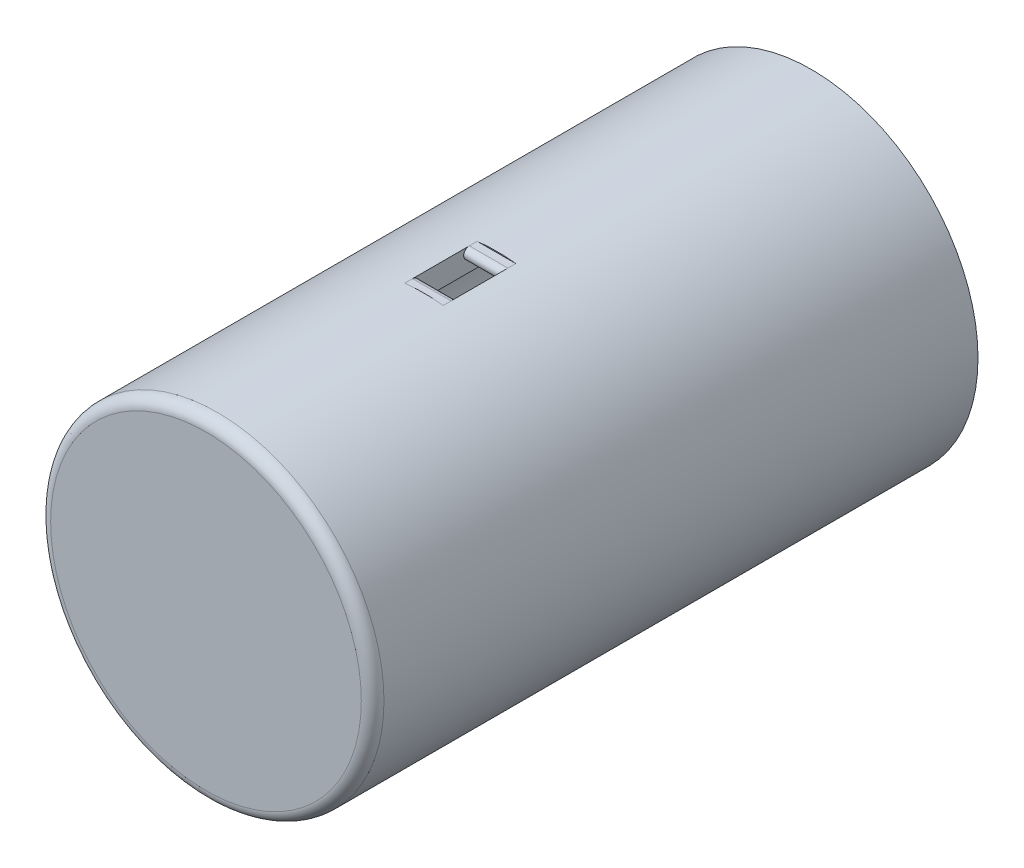
ISO-10303-21;
HEADER;
FILE_DESCRIPTION(('STEP AP214'),'2;1');
FILE_NAME('part.step','',(''),(''),'','','');
FILE_SCHEMA(('AUTOMOTIVE_DESIGN { 1 0 10303 214 1 1 1 1 }'));
ENDSEC;
DATA;
#1=APPLICATION_CONTEXT('core data for automotive mechanical design processes');
#2=APPLICATION_PROTOCOL_DEFINITION('international standard','automotive_design',2000,#1);
#3=PRODUCT_CONTEXT('',#1,'mechanical');
#4=PRODUCT('Part','Part','',(#3));
#5=PRODUCT_RELATED_PRODUCT_CATEGORY('part','',(#4));
#6=PRODUCT_DEFINITION_FORMATION('','',#4);
#7=PRODUCT_DEFINITION_CONTEXT('part definition',#1,'design');
#8=PRODUCT_DEFINITION('design','',#6,#7);
#9=PRODUCT_DEFINITION_SHAPE('','',#8);
#10=(LENGTH_UNIT() NAMED_UNIT(*) SI_UNIT(.MILLI.,.METRE.));
#11=(NAMED_UNIT(*) PLANE_ANGLE_UNIT() SI_UNIT($,.RADIAN.));
#12=(NAMED_UNIT(*) SI_UNIT($,.STERADIAN.) SOLID_ANGLE_UNIT());
#13=UNCERTAINTY_MEASURE_WITH_UNIT(LENGTH_MEASURE(1.E-05),#10,'distance_accuracy_value','');
#14=(GEOMETRIC_REPRESENTATION_CONTEXT(3) GLOBAL_UNCERTAINTY_ASSIGNED_CONTEXT((#13)) GLOBAL_UNIT_ASSIGNED_CONTEXT((#10,
#11,#12)) REPRESENTATION_CONTEXT('',''));
#15=CARTESIAN_POINT('',(0.,0.,0.));
#16=DIRECTION('',(0.,0.,1.));
#17=DIRECTION('',(1.,0.,0.));
#18=AXIS2_PLACEMENT_3D('',#15,#16,#17);
#19=CARTESIAN_POINT('',(-1.7,14.7,27.7738477170273));
#20=DIRECTION('',(0.,0.,-1.));
#21=DIRECTION('',(-1.,0.,0.));
#22=AXIS2_PLACEMENT_3D('',#19,#20,#21);
#23=PLANE('',#22);
#24=DIRECTION('',(-1.,0.,0.));
#25=VECTOR('',#24,1.);
#26=CARTESIAN_POINT('',(14.702,14.6013697987552,27.7738477170273));
#27=LINE('',#26,#25);
#28=CARTESIAN_POINT('',(1.69999999999999,14.6013697987552,27.7738477170273));
#29=VERTEX_POINT('',#28);
#30=CARTESIAN_POINT('',(-1.7,14.6013697987552,27.7738477170273));
#31=VERTEX_POINT('',#30);
#32=EDGE_CURVE('E351',#29,#31,#27,.T.);
#33=ORIENTED_EDGE('',*,*,#32,.F.);
#34=CARTESIAN_POINT('',(0.,0.,27.7738477170273));
#35=DIRECTION('',(0.,0.,-1.));
#36=DIRECTION('',(-1.,0.,0.));
#37=AXIS2_PLACEMENT_3D('',#34,#35,#36);
#38=CIRCLE('',#37,14.7);
#39=EDGE_CURVE('E464',#31,#29,#38,.T.);
#40=ORIENTED_EDGE('',*,*,#39,.F.);
#41=EDGE_LOOP('',(#33,#40));
#42=FACE_BOUND('',#41,.T.);
#43=ADVANCED_FACE('F39',(#42),#23,.F.);
#44=CARTESIAN_POINT('',(0.,12.7,0.));
#45=DIRECTION('',(0.,1.,0.));
#46=DIRECTION('',(0.,0.,1.));
#47=AXIS2_PLACEMENT_3D('',#44,#45,#46);
#48=PLANE('',#47);
#49=DIRECTION('',(0.,0.,1.));
#50=VECTOR('',#49,1.);
#51=CARTESIAN_POINT('',(1.7,12.7,0.));
#52=LINE('',#51,#50);
#53=CARTESIAN_POINT('',(1.7,12.7,0.));
#54=VERTEX_POINT('',#53);
#55=CARTESIAN_POINT('',(1.7,12.7,27.5667409358408));
#56=VERTEX_POINT('',#55);
#57=EDGE_CURVE('E375',#54,#56,#52,.T.);
#58=ORIENTED_EDGE('',*,*,#57,.T.);
#59=DIRECTION('',(1.,0.,0.));
#60=VECTOR('',#59,1.);
#61=CARTESIAN_POINT('',(0.,12.7,27.5667409358408));
#62=LINE('',#61,#60);
#63=CARTESIAN_POINT('',(-1.7,12.7,27.5667409358408));
#64=VERTEX_POINT('',#63);
#65=EDGE_CURVE('E187',#56,#64,#62,.F.);
#66=ORIENTED_EDGE('',*,*,#65,.T.);
#67=DIRECTION('',(0.,0.,-1.));
#68=VECTOR('',#67,1.);
#69=CARTESIAN_POINT('',(-1.7,12.7,0.));
#70=LINE('',#69,#68);
#71=CARTESIAN_POINT('',(-1.7,12.7,0.));
#72=VERTEX_POINT('',#71);
#73=EDGE_CURVE('E339',#64,#72,#70,.T.);
#74=ORIENTED_EDGE('',*,*,#73,.T.);
#75=DIRECTION('',(1.,0.,0.));
#76=VECTOR('',#75,1.);
#77=CARTESIAN_POINT('',(-1.7,12.7,0.));
#78=LINE('',#77,#76);
#79=EDGE_CURVE('E363',#72,#54,#78,.T.);
#80=ORIENTED_EDGE('',*,*,#79,.T.);
#81=EDGE_LOOP('',(#58,#66,#74,#80));
#82=FACE_BOUND('',#81,.T.);
#83=ADVANCED_FACE('F234',(#82),#48,.F.);
#84=CARTESIAN_POINT('',(-1.7,12.7,50.));
#85=VERTEX_POINT('',#84);
#86=CARTESIAN_POINT('',(-1.7,12.7,34.3809544982139));
#87=VERTEX_POINT('',#86);
#88=EDGE_CURVE('E343',#85,#87,#70,.T.);
#89=ORIENTED_EDGE('',*,*,#88,.T.);
#90=DIRECTION('',(-1.,0.,0.));
#91=VECTOR('',#90,1.);
#92=CARTESIAN_POINT('',(0.,12.7,34.3809544982139));
#93=LINE('',#92,#91);
#94=CARTESIAN_POINT('',(1.7,12.7,34.3809544982139));
#95=VERTEX_POINT('',#94);
#96=EDGE_CURVE('E182',#87,#95,#93,.F.);
#97=ORIENTED_EDGE('',*,*,#96,.T.);
#98=CARTESIAN_POINT('',(1.7,12.7,50.));
#99=VERTEX_POINT('',#98);
#100=EDGE_CURVE('E336',#95,#99,#52,.T.);
#101=ORIENTED_EDGE('',*,*,#100,.T.);
#102=DIRECTION('',(-1.,0.,0.));
#103=VECTOR('',#102,1.);
#104=CARTESIAN_POINT('',(-1.7,12.7,50.));
#105=LINE('',#104,#103);
#106=EDGE_CURVE('E371',#99,#85,#105,.T.);
#107=ORIENTED_EDGE('',*,*,#106,.T.);
#108=EDGE_LOOP('',(#89,#97,#101,#107));
#109=FACE_BOUND('',#108,.T.);
#110=ADVANCED_FACE('F245',(#109),#48,.F.);
#111=CARTESIAN_POINT('',(0.,0.,0.));
#112=DIRECTION('',(0.,0.,1.));
#113=DIRECTION('',(1.,0.,0.));
#114=AXIS2_PLACEMENT_3D('',#111,#112,#113);
#115=PLANE('',#114);
#116=CARTESIAN_POINT('',(0.,0.,0.));
#117=DIRECTION('',(0.,0.,1.));
#118=DIRECTION('',(1.,0.,0.));
#119=AXIS2_PLACEMENT_3D('',#116,#117,#118);
#120=CIRCLE('',#119,14.7);
#121=CARTESIAN_POINT('',(14.7,0.,0.));
#122=VERTEX_POINT('',#121);
#123=EDGE_CURVE('E450',#122,#122,#120,.T.);
#124=ORIENTED_EDGE('',*,*,#123,.F.);
#125=EDGE_LOOP('',(#124));
#126=FACE_BOUND('',#125,.T.);
#127=ORIENTED_EDGE('',*,*,#79,.F.);
#128=DIRECTION('',(0.,1.,0.));
#129=VECTOR('',#128,1.);
#130=CARTESIAN_POINT('',(-1.7,-14.701,0.));
#131=LINE('',#130,#129);
#132=CARTESIAN_POINT('',(-1.7,12.5857061780418,0.));
#133=VERTEX_POINT('',#132);
#134=EDGE_CURVE('E356',#133,#72,#131,.T.);
#135=ORIENTED_EDGE('',*,*,#134,.F.);
#136=CARTESIAN_POINT('',(0.,0.,0.));
#137=DIRECTION('',(0.,0.,1.));
#138=DIRECTION('',(1.,0.,0.));
#139=AXIS2_PLACEMENT_3D('',#136,#137,#138);
#140=CIRCLE('',#139,12.7);
#141=CARTESIAN_POINT('',(-1.7,-12.5857061780418,0.));
#142=VERTEX_POINT('',#141);
#143=EDGE_CURVE('E443',#142,#133,#140,.F.);
#144=ORIENTED_EDGE('',*,*,#143,.F.);
#145=DIRECTION('',(0.,-1.,0.));
#146=VECTOR('',#145,1.);
#147=CARTESIAN_POINT('',(-1.7,14.701,0.));
#148=LINE('',#147,#146);
#149=CARTESIAN_POINT('',(-1.7,-12.7,0.));
#150=VERTEX_POINT('',#149);
#151=EDGE_CURVE('E430',#142,#150,#148,.T.);
#152=ORIENTED_EDGE('',*,*,#151,.T.);
#153=DIRECTION('',(-1.,0.,0.));
#154=VECTOR('',#153,1.);
#155=CARTESIAN_POINT('',(1.7,-12.7,0.));
#156=LINE('',#155,#154);
#157=CARTESIAN_POINT('',(1.7,-12.7,0.));
#158=VERTEX_POINT('',#157);
#159=EDGE_CURVE('E423',#158,#150,#156,.T.);
#160=ORIENTED_EDGE('',*,*,#159,.F.);
#161=DIRECTION('',(0.,-1.,0.));
#162=VECTOR('',#161,1.);
#163=CARTESIAN_POINT('',(1.7,14.701,0.));
#164=LINE('',#163,#162);
#165=CARTESIAN_POINT('',(1.7,-12.5857061780418,0.));
#166=VERTEX_POINT('',#165);
#167=EDGE_CURVE('E413',#166,#158,#164,.T.);
#168=ORIENTED_EDGE('',*,*,#167,.F.);
#169=CARTESIAN_POINT('',(1.7,12.5857061780418,0.));
#170=VERTEX_POINT('',#169);
#171=EDGE_CURVE('E442',#170,#166,#140,.F.);
#172=ORIENTED_EDGE('',*,*,#171,.F.);
#173=DIRECTION('',(0.,1.,0.));
#174=VECTOR('',#173,1.);
#175=CARTESIAN_POINT('',(1.7,-14.701,0.));
#176=LINE('',#175,#174);
#177=EDGE_CURVE('E377',#170,#54,#176,.T.);
#178=ORIENTED_EDGE('',*,*,#177,.T.);
#179=EDGE_LOOP('',(#127,#135,#144,#152,#160,#168,#172,#178));
#180=FACE_BOUND('',#179,.T.);
#181=ADVANCED_FACE('F296',(#126,#180),#115,.F.);
#182=CARTESIAN_POINT('',(0.,0.,-0.001000000000001));
#183=DIRECTION('',(0.,0.,1.));
#184=DIRECTION('',(1.,0.,0.));
#185=AXIS2_PLACEMENT_3D('',#182,#183,#184);
#186=CYLINDRICAL_SURFACE('',#185,12.7);
#187=CARTESIAN_POINT('',(0.,0.,50.));
#188=DIRECTION('',(0.,0.,1.));
#189=DIRECTION('',(1.,0.,0.));
#190=AXIS2_PLACEMENT_3D('',#187,#188,#189);
#191=CIRCLE('',#190,12.7);
#192=CARTESIAN_POINT('',(1.7,-12.5857061780418,50.));
#193=VERTEX_POINT('',#192);
#194=CARTESIAN_POINT('',(1.7,12.5857061780418,50.));
#195=VERTEX_POINT('',#194);
#196=EDGE_CURVE('E439',#193,#195,#191,.T.);
#197=ORIENTED_EDGE('',*,*,#196,.T.);
#198=DIRECTION('',(0.,0.,1.));
#199=VECTOR('',#198,1.);
#200=CARTESIAN_POINT('',(1.7,12.5857061780418,-0.001000000000001));
#201=LINE('',#200,#199);
#202=EDGE_CURVE('E369',#195,#170,#201,.F.);
#203=ORIENTED_EDGE('',*,*,#202,.T.);
#204=ORIENTED_EDGE('',*,*,#171,.T.);
#205=DIRECTION('',(0.,0.,1.));
#206=VECTOR('',#205,1.);
#207=CARTESIAN_POINT('',(1.7,-12.5857061780418,-0.001000000000001));
#208=LINE('',#207,#206);
#209=EDGE_CURVE('E419',#166,#193,#208,.T.);
#210=ORIENTED_EDGE('',*,*,#209,.T.);
#211=EDGE_LOOP('',(#197,#203,#204,#210));
#212=FACE_BOUND('',#211,.T.);
#213=ADVANCED_FACE('F280',(#212),#186,.F.);
#214=CARTESIAN_POINT('',(1.7,-14.7,34.1738477170273));
#215=DIRECTION('',(0.,0.,1.));
#216=DIRECTION('',(1.,0.,0.));
#217=AXIS2_PLACEMENT_3D('',#214,#215,#216);
#218=PLANE('',#217);
#219=DIRECTION('',(-1.,0.,0.));
#220=VECTOR('',#219,1.);
#221=CARTESIAN_POINT('',(14.702,-14.6013697987552,34.1738477170273));
#222=LINE('',#221,#220);
#223=CARTESIAN_POINT('',(1.7,-14.6013697987552,34.1738477170273));
#224=VERTEX_POINT('',#223);
#225=CARTESIAN_POINT('',(-1.7,-14.6013697987552,34.1738477170273));
#226=VERTEX_POINT('',#225);
#227=EDGE_CURVE('E402',#224,#226,#222,.T.);
#228=ORIENTED_EDGE('',*,*,#227,.F.);
#229=CARTESIAN_POINT('',(0.,0.,34.1738477170273));
#230=DIRECTION('',(0.,0.,1.));
#231=DIRECTION('',(1.,0.,0.));
#232=AXIS2_PLACEMENT_3D('',#229,#230,#231);
#233=CIRCLE('',#232,14.7);
#234=EDGE_CURVE('E458',#226,#224,#233,.T.);
#235=ORIENTED_EDGE('',*,*,#234,.F.);
#236=EDGE_LOOP('',(#228,#235));
#237=FACE_BOUND('',#236,.T.);
#238=ADVANCED_FACE('F271',(#237),#218,.F.);
#239=CARTESIAN_POINT('',(0.,-12.7,0.));
#240=DIRECTION('',(0.,-1.,0.));
#241=DIRECTION('',(0.,0.,-1.));
#242=AXIS2_PLACEMENT_3D('',#239,#240,#241);
#243=PLANE('',#242);
#244=DIRECTION('',(0.,0.,1.));
#245=VECTOR('',#244,1.);
#246=CARTESIAN_POINT('',(-1.7,-12.7,0.));
#247=LINE('',#246,#245);
#248=CARTESIAN_POINT('',(-1.7,-12.7,27.5667409358408));
#249=VERTEX_POINT('',#248);
#250=EDGE_CURVE('E431',#150,#249,#247,.T.);
#251=ORIENTED_EDGE('',*,*,#250,.T.);
#252=DIRECTION('',(-1.,0.,0.));
#253=VECTOR('',#252,1.);
#254=CARTESIAN_POINT('',(0.,-12.7,27.5667409358408));
#255=LINE('',#254,#253);
#256=CARTESIAN_POINT('',(1.7,-12.7,27.5667409358408));
#257=VERTEX_POINT('',#256);
#258=EDGE_CURVE('E477',#249,#257,#255,.F.);
#259=ORIENTED_EDGE('',*,*,#258,.T.);
#260=DIRECTION('',(0.,0.,-1.));
#261=VECTOR('',#260,1.);
#262=CARTESIAN_POINT('',(1.7,-12.7,0.));
#263=LINE('',#262,#261);
#264=EDGE_CURVE('E412',#257,#158,#263,.T.);
#265=ORIENTED_EDGE('',*,*,#264,.T.);
#266=ORIENTED_EDGE('',*,*,#159,.T.);
#267=EDGE_LOOP('',(#251,#259,#265,#266));
#268=FACE_BOUND('',#267,.T.);
#269=ADVANCED_FACE('F277',(#268),#243,.F.);
#270=CARTESIAN_POINT('',(1.7,-12.7,50.));
#271=VERTEX_POINT('',#270);
#272=CARTESIAN_POINT('',(1.7,-12.7,34.3809544982139));
#273=VERTEX_POINT('',#272);
#274=EDGE_CURVE('E414',#271,#273,#263,.T.);
#275=ORIENTED_EDGE('',*,*,#274,.T.);
#276=DIRECTION('',(1.,0.,0.));
#277=VECTOR('',#276,1.);
#278=CARTESIAN_POINT('',(0.,-12.7,34.3809544982139));
#279=LINE('',#278,#277);
#280=CARTESIAN_POINT('',(-1.7,-12.7,34.3809544982139));
#281=VERTEX_POINT('',#280);
#282=EDGE_CURVE('E491',#273,#281,#279,.F.);
#283=ORIENTED_EDGE('',*,*,#282,.T.);
#284=CARTESIAN_POINT('',(-1.7,-12.7,50.));
#285=VERTEX_POINT('',#284);
#286=EDGE_CURVE('E427',#281,#285,#247,.T.);
#287=ORIENTED_EDGE('',*,*,#286,.T.);
#288=DIRECTION('',(1.,0.,0.));
#289=VECTOR('',#288,1.);
#290=CARTESIAN_POINT('',(1.7,-12.7,50.));
#291=LINE('',#290,#289);
#292=EDGE_CURVE('E428',#285,#271,#291,.T.);
#293=ORIENTED_EDGE('',*,*,#292,.T.);
#294=EDGE_LOOP('',(#275,#283,#287,#293));
#295=FACE_BOUND('',#294,.T.);
#296=ADVANCED_FACE('F288',(#295),#243,.F.);
#297=CARTESIAN_POINT('',(0.,0.,50.));
#298=DIRECTION('',(0.,0.,-1.));
#299=DIRECTION('',(-1.,0.,0.));
#300=AXIS2_PLACEMENT_3D('',#297,#298,#299);
#301=CYLINDRICAL_SURFACE('',#300,14.7);
#302=CARTESIAN_POINT('',(0.,0.,52.4));
#303=DIRECTION('',(0.,0.,1.));
#304=DIRECTION('',(1.,0.,0.));
#305=AXIS2_PLACEMENT_3D('',#302,#303,#304);
#306=CIRCLE('',#305,14.7);
#307=CARTESIAN_POINT('',(14.7,0.,52.4));
#308=VERTEX_POINT('',#307);
#309=EDGE_CURVE('E11',#308,#308,#306,.F.);
#310=ORIENTED_EDGE('',*,*,#309,.T.);
#311=EDGE_LOOP('',(#310));
#312=FACE_BOUND('',#311,.T.);
#313=DIRECTION('',(0.,0.,-1.));
#314=VECTOR('',#313,1.);
#315=CARTESIAN_POINT('',(-1.7,14.6013697987552,50.));
#316=LINE('',#315,#314);
#317=CARTESIAN_POINT('',(-1.7,14.6013697987552,34.1738477170273));
#318=VERTEX_POINT('',#317);
#319=CARTESIAN_POINT('',(-1.7,14.6013697987552,33.4795846994587));
#320=VERTEX_POINT('',#319);
#321=EDGE_CURVE('E472',#318,#320,#316,.T.);
#322=ORIENTED_EDGE('',*,*,#321,.T.);
#323=CARTESIAN_POINT('',(-1.7,14.6013697987552,28.4681107345959));
#324=VERTEX_POINT('',#323);
#325=EDGE_CURVE('E65',#320,#324,#316,.T.);
#326=ORIENTED_EDGE('',*,*,#325,.T.);
#327=DIRECTION('',(0.,0.,1.));
#328=VECTOR('',#327,1.);
#329=CARTESIAN_POINT('',(-1.7,14.6013697987552,27.7738477170273));
#330=LINE('',#329,#328);
#331=EDGE_CURVE('E176',#31,#324,#330,.T.);
#332=ORIENTED_EDGE('',*,*,#331,.F.);
#333=ORIENTED_EDGE('',*,*,#39,.T.);
#334=DIRECTION('',(0.,0.,-1.));
#335=VECTOR('',#334,1.);
#336=CARTESIAN_POINT('',(1.69999999999999,14.6013697987552,50.));
#337=LINE('',#336,#335);
#338=CARTESIAN_POINT('',(1.69999999999999,14.6013697987552,28.4681107345959));
#339=VERTEX_POINT('',#338);
#340=EDGE_CURVE('E467',#29,#339,#337,.F.);
#341=ORIENTED_EDGE('',*,*,#340,.T.);
#342=CARTESIAN_POINT('',(1.7,14.6013697987552,33.4795846994587));
#343=VERTEX_POINT('',#342);
#344=EDGE_CURVE('E53',#339,#343,#337,.F.);
#345=ORIENTED_EDGE('',*,*,#344,.T.);
#346=DIRECTION('',(0.,0.,-1.));
#347=VECTOR('',#346,1.);
#348=CARTESIAN_POINT('',(1.7,14.6013697987552,34.1738477170273));
#349=LINE('',#348,#347);
#350=CARTESIAN_POINT('',(1.69999999999999,14.6013697987552,34.1738477170273));
#351=VERTEX_POINT('',#350);
#352=EDGE_CURVE('E338',#351,#343,#349,.T.);
#353=ORIENTED_EDGE('',*,*,#352,.F.);
#354=CARTESIAN_POINT('',(0.,0.,34.1738477170273));
#355=DIRECTION('',(0.,0.,1.));
#356=DIRECTION('',(1.,0.,0.));
#357=AXIS2_PLACEMENT_3D('',#354,#355,#356);
#358=CIRCLE('',#357,14.7);
#359=EDGE_CURVE('E466',#351,#318,#358,.T.);
#360=ORIENTED_EDGE('',*,*,#359,.T.);
#361=EDGE_LOOP('',(#322,#326,#332,#333,#341,#345,#353,#360));
#362=FACE_BOUND('',#361,.T.);
#363=DIRECTION('',(0.,0.,-1.));
#364=VECTOR('',#363,1.);
#365=CARTESIAN_POINT('',(1.7,-14.6013697987552,50.));
#366=LINE('',#365,#364);
#367=CARTESIAN_POINT('',(1.7,-14.6013697987552,33.4795846994587));
#368=VERTEX_POINT('',#367);
#369=EDGE_CURVE('E459',#224,#368,#366,.T.);
#370=ORIENTED_EDGE('',*,*,#369,.T.);
#371=CARTESIAN_POINT('',(1.7,-14.6013697987552,28.4681107345959));
#372=VERTEX_POINT('',#371);
#373=EDGE_CURVE('E457',#368,#372,#366,.T.);
#374=ORIENTED_EDGE('',*,*,#373,.T.);
#375=DIRECTION('',(0.,0.,1.));
#376=VECTOR('',#375,1.);
#377=CARTESIAN_POINT('',(1.7,-14.6013697987552,29.6752175157825));
#378=LINE('',#377,#376);
#379=CARTESIAN_POINT('',(1.69999999999999,-14.6013697987552,27.7738477170273));
#380=VERTEX_POINT('',#379);
#381=EDGE_CURVE('E394',#380,#372,#378,.T.);
#382=ORIENTED_EDGE('',*,*,#381,.F.);
#383=CARTESIAN_POINT('',(0.,0.,27.7738477170273));
#384=DIRECTION('',(0.,0.,-1.));
#385=DIRECTION('',(-1.,0.,0.));
#386=AXIS2_PLACEMENT_3D('',#383,#384,#385);
#387=CIRCLE('',#386,14.7);
#388=CARTESIAN_POINT('',(-1.7,-14.6013697987552,27.7738477170273));
#389=VERTEX_POINT('',#388);
#390=EDGE_CURVE('E448',#380,#389,#387,.T.);
#391=ORIENTED_EDGE('',*,*,#390,.T.);
#392=DIRECTION('',(0.,0.,-1.));
#393=VECTOR('',#392,1.);
#394=CARTESIAN_POINT('',(-1.7,-14.6013697987552,50.));
#395=LINE('',#394,#393);
#396=CARTESIAN_POINT('',(-1.7,-14.6013697987552,28.4681107345959));
#397=VERTEX_POINT('',#396);
#398=EDGE_CURVE('E453',#389,#397,#395,.F.);
#399=ORIENTED_EDGE('',*,*,#398,.T.);
#400=CARTESIAN_POINT('',(-1.7,-14.6013697987552,33.4795846994587));
#401=VERTEX_POINT('',#400);
#402=EDGE_CURVE('E103',#397,#401,#395,.F.);
#403=ORIENTED_EDGE('',*,*,#402,.T.);
#404=DIRECTION('',(0.,0.,-1.));
#405=VECTOR('',#404,1.);
#406=CARTESIAN_POINT('',(-1.7,-14.6013697987552,32.2724779182721));
#407=LINE('',#406,#405);
#408=EDGE_CURVE('E389',#226,#401,#407,.T.);
#409=ORIENTED_EDGE('',*,*,#408,.F.);
#410=ORIENTED_EDGE('',*,*,#234,.T.);
#411=EDGE_LOOP('',(#370,#374,#382,#391,#399,#403,#409,#410));
#412=FACE_BOUND('',#411,.T.);
#413=ORIENTED_EDGE('',*,*,#123,.T.);
#414=EDGE_LOOP('',(#413));
#415=FACE_BOUND('',#414,.T.);
#416=ADVANCED_FACE('F298',(#312,#362,#412,#415),#301,.T.);
#417=ORIENTED_EDGE('',*,*,#143,.T.);
#418=DIRECTION('',(0.,0.,1.));
#419=VECTOR('',#418,1.);
#420=CARTESIAN_POINT('',(-1.7,12.5857061780418,-0.001000000000001));
#421=LINE('',#420,#419);
#422=CARTESIAN_POINT('',(-1.7,12.5857061780418,50.));
#423=VERTEX_POINT('',#422);
#424=EDGE_CURVE('E365',#133,#423,#421,.T.);
#425=ORIENTED_EDGE('',*,*,#424,.T.);
#426=CARTESIAN_POINT('',(-1.7,-12.5857061780418,50.));
#427=VERTEX_POINT('',#426);
#428=EDGE_CURVE('E433',#423,#427,#191,.T.);
#429=ORIENTED_EDGE('',*,*,#428,.T.);
#430=DIRECTION('',(0.,0.,1.));
#431=VECTOR('',#430,1.);
#432=CARTESIAN_POINT('',(-1.7,-12.5857061780418,-0.001000000000001));
#433=LINE('',#432,#431);
#434=EDGE_CURVE('E424',#427,#142,#433,.F.);
#435=ORIENTED_EDGE('',*,*,#434,.T.);
#436=EDGE_LOOP('',(#417,#425,#429,#435));
#437=FACE_BOUND('',#436,.T.);
#438=ADVANCED_FACE('F291',(#437),#186,.F.);
#439=CARTESIAN_POINT('',(-1.7,14.701,0.));
#440=DIRECTION('',(1.,0.,0.));
#441=DIRECTION('',(0.,0.,-1.));
#442=AXIS2_PLACEMENT_3D('',#439,#440,#441);
#443=PLANE('',#442);
#444=DIRECTION('',(0.,-0.707106781186549,0.707106781186546));
#445=VECTOR('',#444,1.);
#446=CARTESIAN_POINT('',(-1.7,-12.7,27.7738477170273));
#447=LINE('',#446,#445);
#448=CARTESIAN_POINT('',(-1.7,-12.8464466094067,27.920294326434));
#449=VERTEX_POINT('',#448);
#450=CARTESIAN_POINT('',(-1.7,-13.7478164081619,28.8216641251892));
#451=VERTEX_POINT('',#450);
#452=EDGE_CURVE('E383',#449,#451,#447,.T.);
#453=ORIENTED_EDGE('',*,*,#452,.F.);
#454=CARTESIAN_POINT('',(-1.7,-13.2,27.5667409358408));
#455=DIRECTION('',(1.,0.,0.));
#456=DIRECTION('',(0.,0.,-1.));
#457=AXIS2_PLACEMENT_3D('',#454,#455,#456);
#458=CIRCLE('',#457,0.5);
#459=EDGE_CURVE('E115',#449,#249,#458,.F.);
#460=ORIENTED_EDGE('',*,*,#459,.T.);
#461=ORIENTED_EDGE('',*,*,#250,.F.);
#462=ORIENTED_EDGE('',*,*,#151,.F.);
#463=ORIENTED_EDGE('',*,*,#434,.F.);
#464=DIRECTION('',(0.,-1.,0.));
#465=VECTOR('',#464,1.);
#466=CARTESIAN_POINT('',(-1.7,14.701,50.));
#467=LINE('',#466,#465);
#468=EDGE_CURVE('E422',#427,#285,#467,.T.);
#469=ORIENTED_EDGE('',*,*,#468,.T.);
#470=ORIENTED_EDGE('',*,*,#286,.F.);
#471=CARTESIAN_POINT('',(-1.7,-13.2,34.3809544982139));
#472=DIRECTION('',(1.,0.,0.));
#473=DIRECTION('',(0.,0.,-1.));
#474=AXIS2_PLACEMENT_3D('',#471,#472,#473);
#475=CIRCLE('',#474,0.5);
#476=CARTESIAN_POINT('',(-1.7,-12.8464466094067,34.0274011076206));
#477=VERTEX_POINT('',#476);
#478=EDGE_CURVE('E206',#281,#477,#475,.F.);
#479=ORIENTED_EDGE('',*,*,#478,.T.);
#480=DIRECTION('',(0.,0.707106781186543,0.707106781186552));
#481=VECTOR('',#480,1.);
#482=CARTESIAN_POINT('',(-1.7,-12.7,34.1738477170273));
#483=LINE('',#482,#481);
#484=CARTESIAN_POINT('',(-1.7,-13.7478164081619,33.1260313088654));
#485=VERTEX_POINT('',#484);
#486=EDGE_CURVE('E404',#485,#477,#483,.T.);
#487=ORIENTED_EDGE('',*,*,#486,.F.);
#488=CARTESIAN_POINT('',(-1.7,-14.1013697987552,33.4795846994587));
#489=DIRECTION('',(1.,0.,0.));
#490=DIRECTION('',(0.,0.,-1.));
#491=AXIS2_PLACEMENT_3D('',#488,#489,#490);
#492=CIRCLE('',#491,0.5);
#493=EDGE_CURVE('E202',#485,#401,#492,.F.);
#494=ORIENTED_EDGE('',*,*,#493,.T.);
#495=ORIENTED_EDGE('',*,*,#402,.F.);
#496=CARTESIAN_POINT('',(-1.7,-14.1013697987552,28.4681107345959));
#497=DIRECTION('',(1.,0.,0.));
#498=DIRECTION('',(0.,0.,-1.));
#499=AXIS2_PLACEMENT_3D('',#496,#497,#498);
#500=CIRCLE('',#499,0.5);
#501=EDGE_CURVE('E200',#397,#451,#500,.F.);
#502=ORIENTED_EDGE('',*,*,#501,.T.);
#503=EDGE_LOOP('',(#453,#460,#461,#462,#463,#469,#470,#479,#487,#494,#495,#502));
#504=FACE_BOUND('',#503,.T.);
#505=ADVANCED_FACE('F284',(#504),#443,.T.);
#506=CARTESIAN_POINT('',(1.7,14.701,0.));
#507=DIRECTION('',(-1.,0.,0.));
#508=DIRECTION('',(0.,0.,1.));
#509=AXIS2_PLACEMENT_3D('',#506,#507,#508);
#510=PLANE('',#509);
#511=DIRECTION('',(0.,0.707106781186549,-0.707106781186546));
#512=VECTOR('',#511,1.);
#513=CARTESIAN_POINT('',(1.7,-12.7,27.7738477170273));
#514=LINE('',#513,#512);
#515=CARTESIAN_POINT('',(1.7,-13.7478164081619,28.8216641251892));
#516=VERTEX_POINT('',#515);
#517=CARTESIAN_POINT('',(1.7,-12.8464466094067,27.920294326434));
#518=VERTEX_POINT('',#517);
#519=EDGE_CURVE('E395',#516,#518,#514,.T.);
#520=ORIENTED_EDGE('',*,*,#519,.F.);
#521=CARTESIAN_POINT('',(1.7,-14.1013697987552,28.4681107345959));
#522=DIRECTION('',(-1.,0.,0.));
#523=DIRECTION('',(0.,0.,1.));
#524=AXIS2_PLACEMENT_3D('',#521,#522,#523);
#525=CIRCLE('',#524,0.5);
#526=EDGE_CURVE('E197',#516,#372,#525,.F.);
#527=ORIENTED_EDGE('',*,*,#526,.T.);
#528=ORIENTED_EDGE('',*,*,#373,.F.);
#529=CARTESIAN_POINT('',(1.7,-14.1013697987552,33.4795846994587));
#530=DIRECTION('',(-1.,0.,0.));
#531=DIRECTION('',(0.,0.,1.));
#532=AXIS2_PLACEMENT_3D('',#529,#530,#531);
#533=CIRCLE('',#532,0.5);
#534=CARTESIAN_POINT('',(1.7,-13.7478164081619,33.1260313088654));
#535=VERTEX_POINT('',#534);
#536=EDGE_CURVE('E203',#368,#535,#533,.F.);
#537=ORIENTED_EDGE('',*,*,#536,.T.);
#538=DIRECTION('',(0.,-0.707106781186543,-0.707106781186552));
#539=VECTOR('',#538,1.);
#540=CARTESIAN_POINT('',(1.7,-12.7,34.1738477170273));
#541=LINE('',#540,#539);
#542=CARTESIAN_POINT('',(1.7,-12.8464466094067,34.0274011076206));
#543=VERTEX_POINT('',#542);
#544=EDGE_CURVE('E374',#543,#535,#541,.T.);
#545=ORIENTED_EDGE('',*,*,#544,.F.);
#546=CARTESIAN_POINT('',(1.7,-13.2,34.3809544982139));
#547=DIRECTION('',(-1.,0.,0.));
#548=DIRECTION('',(0.,0.,1.));
#549=AXIS2_PLACEMENT_3D('',#546,#547,#548);
#550=CIRCLE('',#549,0.5);
#551=EDGE_CURVE('E207',#543,#273,#550,.F.);
#552=ORIENTED_EDGE('',*,*,#551,.T.);
#553=ORIENTED_EDGE('',*,*,#274,.F.);
#554=DIRECTION('',(0.,-1.,0.));
#555=VECTOR('',#554,1.);
#556=CARTESIAN_POINT('',(1.7,14.701,50.));
#557=LINE('',#556,#555);
#558=EDGE_CURVE('E399',#193,#271,#557,.T.);
#559=ORIENTED_EDGE('',*,*,#558,.F.);
#560=ORIENTED_EDGE('',*,*,#209,.F.);
#561=ORIENTED_EDGE('',*,*,#167,.T.);
#562=ORIENTED_EDGE('',*,*,#264,.F.);
#563=CARTESIAN_POINT('',(1.7,-13.2,27.5667409358408));
#564=DIRECTION('',(-1.,0.,0.));
#565=DIRECTION('',(0.,0.,1.));
#566=AXIS2_PLACEMENT_3D('',#563,#564,#565);
#567=CIRCLE('',#566,0.5);
#568=EDGE_CURVE('E194',#257,#518,#567,.F.);
#569=ORIENTED_EDGE('',*,*,#568,.T.);
#570=EDGE_LOOP('',(#520,#527,#528,#537,#545,#552,#553,#559,#560,#561,#562,#569));
#571=FACE_BOUND('',#570,.T.);
#572=ADVANCED_FACE('F283',(#571),#510,.T.);
#573=CARTESIAN_POINT('',(1.7,-14.7,27.7738477170273));
#574=DIRECTION('',(0.,0.,-1.));
#575=DIRECTION('',(-1.,0.,0.));
#576=AXIS2_PLACEMENT_3D('',#573,#574,#575);
#577=PLANE('',#576);
#578=ORIENTED_EDGE('',*,*,#390,.F.);
#579=DIRECTION('',(-1.,0.,0.));
#580=VECTOR('',#579,1.);
#581=CARTESIAN_POINT('',(14.702,-14.6013697987552,27.7738477170273));
#582=LINE('',#581,#580);
#583=EDGE_CURVE('E388',#380,#389,#582,.T.);
#584=ORIENTED_EDGE('',*,*,#583,.T.);
#585=EDGE_LOOP('',(#578,#584));
#586=FACE_BOUND('',#585,.T.);
#587=ADVANCED_FACE('F265',(#586),#577,.F.);
#588=CARTESIAN_POINT('',(14.702,-12.7,27.7738477170273));
#589=DIRECTION('',(0.,-0.707106781186546,-0.707106781186549));
#590=DIRECTION('',(0.,0.707106781186549,-0.707106781186546));
#591=AXIS2_PLACEMENT_3D('',#588,#589,#590);
#592=PLANE('',#591);
#593=ORIENTED_EDGE('',*,*,#519,.T.);
#594=DIRECTION('',(-1.,0.,0.));
#595=VECTOR('',#594,1.);
#596=CARTESIAN_POINT('',(14.702,-12.8464466094067,27.920294326434));
#597=LINE('',#596,#595);
#598=EDGE_CURVE('E478',#518,#449,#597,.T.);
#599=ORIENTED_EDGE('',*,*,#598,.T.);
#600=ORIENTED_EDGE('',*,*,#452,.T.);
#601=DIRECTION('',(-1.,0.,0.));
#602=VECTOR('',#601,1.);
#603=CARTESIAN_POINT('',(14.702,-13.7478164081619,28.8216641251892));
#604=LINE('',#603,#602);
#605=EDGE_CURVE('E473',#451,#516,#604,.F.);
#606=ORIENTED_EDGE('',*,*,#605,.T.);
#607=EDGE_LOOP('',(#593,#599,#600,#606));
#608=FACE_BOUND('',#607,.T.);
#609=ADVANCED_FACE('F258',(#608),#592,.F.);
#610=CARTESIAN_POINT('',(14.702,-14.6013697987552,29.6752175157825));
#611=DIRECTION('',(0.,1.,0.));
#612=DIRECTION('',(0.,0.,1.));
#613=AXIS2_PLACEMENT_3D('',#610,#611,#612);
#614=PLANE('',#613);
#615=ORIENTED_EDGE('',*,*,#381,.T.);
#616=DIRECTION('',(-1.,0.,0.));
#617=VECTOR('',#616,1.);
#618=CARTESIAN_POINT('',(14.702,-14.6013697987552,28.4681107345959));
#619=LINE('',#618,#617);
#620=EDGE_CURVE('E481',#372,#397,#619,.T.);
#621=ORIENTED_EDGE('',*,*,#620,.T.);
#622=ORIENTED_EDGE('',*,*,#398,.F.);
#623=ORIENTED_EDGE('',*,*,#583,.F.);
#624=EDGE_LOOP('',(#615,#621,#622,#623));
#625=FACE_BOUND('',#624,.T.);
#626=ADVANCED_FACE('F263',(#625),#614,.F.);
#627=CARTESIAN_POINT('',(14.702,-12.7,34.1738477170273));
#628=DIRECTION('',(0.,-0.707106781186552,0.707106781186543));
#629=DIRECTION('',(0.,-0.707106781186543,-0.707106781186552));
#630=AXIS2_PLACEMENT_3D('',#627,#628,#629);
#631=PLANE('',#630);
#632=ORIENTED_EDGE('',*,*,#544,.T.);
#633=DIRECTION('',(-1.,0.,0.));
#634=VECTOR('',#633,1.);
#635=CARTESIAN_POINT('',(14.702,-13.7478164081619,33.1260313088654));
#636=LINE('',#635,#634);
#637=EDGE_CURVE('E487',#535,#485,#636,.T.);
#638=ORIENTED_EDGE('',*,*,#637,.T.);
#639=ORIENTED_EDGE('',*,*,#486,.T.);
#640=DIRECTION('',(1.,0.,0.));
#641=VECTOR('',#640,1.);
#642=CARTESIAN_POINT('',(14.702,-12.8464466094067,34.0274011076206));
#643=LINE('',#642,#641);
#644=EDGE_CURVE('E483',#477,#543,#643,.T.);
#645=ORIENTED_EDGE('',*,*,#644,.T.);
#646=EDGE_LOOP('',(#632,#638,#639,#645));
#647=FACE_BOUND('',#646,.T.);
#648=ADVANCED_FACE('F260',(#647),#631,.F.);
#649=CARTESIAN_POINT('',(14.702,-14.6013697987552,32.2724779182721));
#650=DIRECTION('',(0.,1.,0.));
#651=DIRECTION('',(0.,0.,1.));
#652=AXIS2_PLACEMENT_3D('',#649,#650,#651);
#653=PLANE('',#652);
#654=ORIENTED_EDGE('',*,*,#408,.T.);
#655=DIRECTION('',(-1.,0.,0.));
#656=VECTOR('',#655,1.);
#657=CARTESIAN_POINT('',(14.702,-14.6013697987552,33.4795846994587));
#658=LINE('',#657,#656);
#659=EDGE_CURVE('E489',#401,#368,#658,.F.);
#660=ORIENTED_EDGE('',*,*,#659,.T.);
#661=ORIENTED_EDGE('',*,*,#369,.F.);
#662=ORIENTED_EDGE('',*,*,#227,.T.);
#663=EDGE_LOOP('',(#654,#660,#661,#662));
#664=FACE_BOUND('',#663,.T.);
#665=ADVANCED_FACE('F253',(#664),#653,.F.);
#666=CARTESIAN_POINT('',(1.7,-14.701,0.));
#667=DIRECTION('',(-1.,0.,0.));
#668=DIRECTION('',(0.,0.,1.));
#669=AXIS2_PLACEMENT_3D('',#666,#667,#668);
#670=PLANE('',#669);
#671=DIRECTION('',(0.,-0.707106781186543,0.707106781186552));
#672=VECTOR('',#671,1.);
#673=CARTESIAN_POINT('',(1.7,14.6013697987552,32.2724779182721));
#674=LINE('',#673,#672);
#675=CARTESIAN_POINT('',(1.7,13.7478164081619,33.1260313088654));
#676=VERTEX_POINT('',#675);
#677=CARTESIAN_POINT('',(1.7,12.8464466094067,34.0274011076206));
#678=VERTEX_POINT('',#677);
#679=EDGE_CURVE('E335',#676,#678,#674,.T.);
#680=ORIENTED_EDGE('',*,*,#679,.F.);
#681=CARTESIAN_POINT('',(1.7,14.1013697987552,33.4795846994587));
#682=DIRECTION('',(-1.,0.,0.));
#683=DIRECTION('',(0.,0.,1.));
#684=AXIS2_PLACEMENT_3D('',#681,#682,#683);
#685=CIRCLE('',#684,0.5);
#686=EDGE_CURVE('E165',#676,#343,#685,.F.);
#687=ORIENTED_EDGE('',*,*,#686,.T.);
#688=ORIENTED_EDGE('',*,*,#344,.F.);
#689=CARTESIAN_POINT('',(1.7,14.1013697987552,28.4681107345959));
#690=DIRECTION('',(-1.,0.,0.));
#691=DIRECTION('',(0.,0.,1.));
#692=AXIS2_PLACEMENT_3D('',#689,#690,#691);
#693=CIRCLE('',#692,0.5);
#694=CARTESIAN_POINT('',(1.7,13.7478164081619,28.8216641251892));
#695=VERTEX_POINT('',#694);
#696=EDGE_CURVE('E218',#339,#695,#693,.F.);
#697=ORIENTED_EDGE('',*,*,#696,.T.);
#698=DIRECTION('',(0.,0.707106781186548,0.707106781186546));
#699=VECTOR('',#698,1.);
#700=CARTESIAN_POINT('',(1.7,14.6013697987552,29.6752175157825));
#701=LINE('',#700,#699);
#702=CARTESIAN_POINT('',(1.7,12.8464466094067,27.920294326434));
#703=VERTEX_POINT('',#702);
#704=EDGE_CURVE('E346',#703,#695,#701,.T.);
#705=ORIENTED_EDGE('',*,*,#704,.F.);
#706=CARTESIAN_POINT('',(1.7,13.2,27.5667409358408));
#707=DIRECTION('',(-1.,0.,0.));
#708=DIRECTION('',(0.,0.,1.));
#709=AXIS2_PLACEMENT_3D('',#706,#707,#708);
#710=CIRCLE('',#709,0.5);
#711=EDGE_CURVE('E208',#703,#56,#710,.F.);
#712=ORIENTED_EDGE('',*,*,#711,.T.);
#713=ORIENTED_EDGE('',*,*,#57,.F.);
#714=ORIENTED_EDGE('',*,*,#177,.F.);
#715=ORIENTED_EDGE('',*,*,#202,.F.);
#716=DIRECTION('',(0.,1.,0.));
#717=VECTOR('',#716,1.);
#718=CARTESIAN_POINT('',(1.7,-14.701,50.));
#719=LINE('',#718,#717);
#720=EDGE_CURVE('E368',#195,#99,#719,.T.);
#721=ORIENTED_EDGE('',*,*,#720,.T.);
#722=ORIENTED_EDGE('',*,*,#100,.F.);
#723=CARTESIAN_POINT('',(1.7,13.2,34.3809544982139));
#724=DIRECTION('',(-1.,0.,0.));
#725=DIRECTION('',(0.,0.,1.));
#726=AXIS2_PLACEMENT_3D('',#723,#724,#725);
#727=CIRCLE('',#726,0.5);
#728=EDGE_CURVE('E164',#95,#678,#727,.F.);
#729=ORIENTED_EDGE('',*,*,#728,.T.);
#730=EDGE_LOOP('',(#680,#687,#688,#697,#705,#712,#713,#714,#715,#721,#722,#729));
#731=FACE_BOUND('',#730,.T.);
#732=ADVANCED_FACE('F252',(#731),#670,.T.);
#733=CARTESIAN_POINT('',(-1.7,-14.701,0.));
#734=DIRECTION('',(1.,0.,0.));
#735=DIRECTION('',(0.,0.,-1.));
#736=AXIS2_PLACEMENT_3D('',#733,#734,#735);
#737=PLANE('',#736);
#738=DIRECTION('',(0.,0.707106781186543,-0.707106781186552));
#739=VECTOR('',#738,1.);
#740=CARTESIAN_POINT('',(-1.7,14.6013697987552,32.2724779182721));
#741=LINE('',#740,#739);
#742=CARTESIAN_POINT('',(-1.7,12.8464466094067,34.0274011076206));
#743=VERTEX_POINT('',#742);
#744=CARTESIAN_POINT('',(-1.7,13.7478164081619,33.1260313088654));
#745=VERTEX_POINT('',#744);
#746=EDGE_CURVE('E158',#743,#745,#741,.T.);
#747=ORIENTED_EDGE('',*,*,#746,.F.);
#748=CARTESIAN_POINT('',(-1.7,13.2,34.3809544982139));
#749=DIRECTION('',(1.,0.,0.));
#750=DIRECTION('',(0.,0.,-1.));
#751=AXIS2_PLACEMENT_3D('',#748,#749,#750);
#752=CIRCLE('',#751,0.5);
#753=EDGE_CURVE('E90',#743,#87,#752,.F.);
#754=ORIENTED_EDGE('',*,*,#753,.T.);
#755=ORIENTED_EDGE('',*,*,#88,.F.);
#756=DIRECTION('',(0.,1.,0.));
#757=VECTOR('',#756,1.);
#758=CARTESIAN_POINT('',(-1.7,-14.701,50.));
#759=LINE('',#758,#757);
#760=EDGE_CURVE('E364',#423,#85,#759,.T.);
#761=ORIENTED_EDGE('',*,*,#760,.F.);
#762=ORIENTED_EDGE('',*,*,#424,.F.);
#763=ORIENTED_EDGE('',*,*,#134,.T.);
#764=ORIENTED_EDGE('',*,*,#73,.F.);
#765=CARTESIAN_POINT('',(-1.7,13.2,27.5667409358408));
#766=DIRECTION('',(1.,0.,0.));
#767=DIRECTION('',(0.,0.,-1.));
#768=AXIS2_PLACEMENT_3D('',#765,#766,#767);
#769=CIRCLE('',#768,0.5);
#770=CARTESIAN_POINT('',(-1.7,12.8464466094067,27.920294326434));
#771=VERTEX_POINT('',#770);
#772=EDGE_CURVE('E215',#64,#771,#769,.F.);
#773=ORIENTED_EDGE('',*,*,#772,.T.);
#774=DIRECTION('',(0.,-0.707106781186549,-0.707106781186547));
#775=VECTOR('',#774,1.);
#776=CARTESIAN_POINT('',(-1.7,14.6013697987552,29.6752175157825));
#777=LINE('',#776,#775);
#778=CARTESIAN_POINT('',(-1.7,13.7478164081619,28.8216641251892));
#779=VERTEX_POINT('',#778);
#780=EDGE_CURVE('E353',#779,#771,#777,.T.);
#781=ORIENTED_EDGE('',*,*,#780,.F.);
#782=CARTESIAN_POINT('',(-1.7,14.1013697987552,28.4681107345959));
#783=DIRECTION('',(1.,0.,0.));
#784=DIRECTION('',(0.,0.,-1.));
#785=AXIS2_PLACEMENT_3D('',#782,#783,#784);
#786=CIRCLE('',#785,0.5);
#787=EDGE_CURVE('E214',#779,#324,#786,.F.);
#788=ORIENTED_EDGE('',*,*,#787,.T.);
#789=ORIENTED_EDGE('',*,*,#325,.F.);
#790=CARTESIAN_POINT('',(-1.7,14.1013697987552,33.4795846994587));
#791=DIRECTION('',(1.,0.,0.));
#792=DIRECTION('',(0.,0.,-1.));
#793=AXIS2_PLACEMENT_3D('',#790,#791,#792);
#794=CIRCLE('',#793,0.5);
#795=EDGE_CURVE('E156',#320,#745,#794,.F.);
#796=ORIENTED_EDGE('',*,*,#795,.T.);
#797=EDGE_LOOP('',(#747,#754,#755,#761,#762,#763,#764,#773,#781,#788,#789,#796));
#798=FACE_BOUND('',#797,.T.);
#799=ADVANCED_FACE('F159',(#798),#737,.T.);
#800=CARTESIAN_POINT('',(-1.7,14.7,34.1738477170273));
#801=DIRECTION('',(0.,0.,1.));
#802=DIRECTION('',(1.,0.,0.));
#803=AXIS2_PLACEMENT_3D('',#800,#801,#802);
#804=PLANE('',#803);
#805=ORIENTED_EDGE('',*,*,#359,.F.);
#806=DIRECTION('',(-1.,0.,0.));
#807=VECTOR('',#806,1.);
#808=CARTESIAN_POINT('',(14.702,14.6013697987552,34.1738477170273));
#809=LINE('',#808,#807);
#810=EDGE_CURVE('E174',#351,#318,#809,.T.);
#811=ORIENTED_EDGE('',*,*,#810,.T.);
#812=EDGE_LOOP('',(#805,#811));
#813=FACE_BOUND('',#812,.T.);
#814=ADVANCED_FACE('F247',(#813),#804,.F.);
#815=CARTESIAN_POINT('',(14.702,14.6013697987552,29.6752175157825));
#816=DIRECTION('',(0.,0.707106781186546,-0.707106781186548));
#817=DIRECTION('',(0.,0.707106781186549,0.707106781186547));
#818=AXIS2_PLACEMENT_3D('',#815,#816,#817);
#819=PLANE('',#818);
#820=ORIENTED_EDGE('',*,*,#780,.T.);
#821=DIRECTION('',(1.,0.,0.));
#822=VECTOR('',#821,1.);
#823=CARTESIAN_POINT('',(14.702,12.8464466094067,27.920294326434));
#824=LINE('',#823,#822);
#825=EDGE_CURVE('E498',#771,#703,#824,.T.);
#826=ORIENTED_EDGE('',*,*,#825,.T.);
#827=ORIENTED_EDGE('',*,*,#704,.T.);
#828=DIRECTION('',(-1.,0.,0.));
#829=VECTOR('',#828,1.);
#830=CARTESIAN_POINT('',(14.702,13.7478164081619,28.8216641251892));
#831=LINE('',#830,#829);
#832=EDGE_CURVE('E492',#695,#779,#831,.T.);
#833=ORIENTED_EDGE('',*,*,#832,.T.);
#834=EDGE_LOOP('',(#820,#826,#827,#833));
#835=FACE_BOUND('',#834,.T.);
#836=ADVANCED_FACE('F515',(#835),#819,.F.);
#837=CARTESIAN_POINT('',(14.702,14.6013697987552,27.7738477170273));
#838=DIRECTION('',(0.,-1.,0.));
#839=DIRECTION('',(0.,0.,-1.));
#840=AXIS2_PLACEMENT_3D('',#837,#838,#839);
#841=PLANE('',#840);
#842=ORIENTED_EDGE('',*,*,#331,.T.);
#843=DIRECTION('',(-1.,0.,0.));
#844=VECTOR('',#843,1.);
#845=CARTESIAN_POINT('',(14.702,14.6013697987552,28.4681107345959));
#846=LINE('',#845,#844);
#847=EDGE_CURVE('E181',#324,#339,#846,.F.);
#848=ORIENTED_EDGE('',*,*,#847,.T.);
#849=ORIENTED_EDGE('',*,*,#340,.F.);
#850=ORIENTED_EDGE('',*,*,#32,.T.);
#851=EDGE_LOOP('',(#842,#848,#849,#850));
#852=FACE_BOUND('',#851,.T.);
#853=ADVANCED_FACE('F518',(#852),#841,.F.);
#854=CARTESIAN_POINT('',(14.702,14.6013697987552,32.2724779182721));
#855=DIRECTION('',(0.,0.707106781186552,0.707106781186543));
#856=DIRECTION('',(0.,-0.707106781186543,0.707106781186552));
#857=AXIS2_PLACEMENT_3D('',#854,#855,#856);
#858=PLANE('',#857);
#859=ORIENTED_EDGE('',*,*,#679,.T.);
#860=DIRECTION('',(-1.,0.,0.));
#861=VECTOR('',#860,1.);
#862=CARTESIAN_POINT('',(14.702,12.8464466094067,34.0274011076206));
#863=LINE('',#862,#861);
#864=EDGE_CURVE('E172',#678,#743,#863,.T.);
#865=ORIENTED_EDGE('',*,*,#864,.T.);
#866=ORIENTED_EDGE('',*,*,#746,.T.);
#867=DIRECTION('',(-1.,0.,0.));
#868=VECTOR('',#867,1.);
#869=CARTESIAN_POINT('',(14.702,13.7478164081619,33.1260313088654));
#870=LINE('',#869,#868);
#871=EDGE_CURVE('E171',#745,#676,#870,.F.);
#872=ORIENTED_EDGE('',*,*,#871,.T.);
#873=EDGE_LOOP('',(#859,#865,#866,#872));
#874=FACE_BOUND('',#873,.T.);
#875=ADVANCED_FACE('F167',(#874),#858,.F.);
#876=CARTESIAN_POINT('',(14.702,14.6013697987552,34.1738477170273));
#877=DIRECTION('',(0.,-1.,0.));
#878=DIRECTION('',(0.,0.,-1.));
#879=AXIS2_PLACEMENT_3D('',#876,#877,#878);
#880=PLANE('',#879);
#881=ORIENTED_EDGE('',*,*,#352,.T.);
#882=DIRECTION('',(-1.,0.,0.));
#883=VECTOR('',#882,1.);
#884=CARTESIAN_POINT('',(14.702,14.6013697987552,33.4795846994587));
#885=LINE('',#884,#883);
#886=EDGE_CURVE('E192',#343,#320,#885,.T.);
#887=ORIENTED_EDGE('',*,*,#886,.T.);
#888=ORIENTED_EDGE('',*,*,#321,.F.);
#889=ORIENTED_EDGE('',*,*,#810,.F.);
#890=EDGE_LOOP('',(#881,#887,#888,#889));
#891=FACE_BOUND('',#890,.T.);
#892=ADVANCED_FACE('F701',(#891),#880,.F.);
#893=CARTESIAN_POINT('',(0.,0.,50.));
#894=DIRECTION('',(0.,0.,1.));
#895=DIRECTION('',(1.,0.,0.));
#896=AXIS2_PLACEMENT_3D('',#893,#894,#895);
#897=PLANE('',#896);
#898=ORIENTED_EDGE('',*,*,#428,.F.);
#899=ORIENTED_EDGE('',*,*,#760,.T.);
#900=ORIENTED_EDGE('',*,*,#106,.F.);
#901=ORIENTED_EDGE('',*,*,#720,.F.);
#902=ORIENTED_EDGE('',*,*,#196,.F.);
#903=ORIENTED_EDGE('',*,*,#558,.T.);
#904=ORIENTED_EDGE('',*,*,#292,.F.);
#905=ORIENTED_EDGE('',*,*,#468,.F.);
#906=EDGE_LOOP('',(#898,#899,#900,#901,#902,#903,#904,#905));
#907=FACE_BOUND('',#906,.T.);
#908=ADVANCED_FACE('F603',(#907),#897,.F.);
#909=CARTESIAN_POINT('',(0.,0.,53.4));
#910=DIRECTION('',(0.,0.,1.));
#911=DIRECTION('',(1.,0.,0.));
#912=AXIS2_PLACEMENT_3D('',#909,#910,#911);
#913=PLANE('',#912);
#914=CARTESIAN_POINT('',(0.,0.,53.4));
#915=DIRECTION('',(0.,0.,1.));
#916=DIRECTION('',(1.,0.,0.));
#917=AXIS2_PLACEMENT_3D('',#914,#915,#916);
#918=CIRCLE('',#917,13.7);
#919=CARTESIAN_POINT('',(13.7,0.,53.4));
#920=VERTEX_POINT('',#919);
#921=EDGE_CURVE('E50',#920,#920,#918,.T.);
#922=ORIENTED_EDGE('',*,*,#921,.T.);
#923=EDGE_LOOP('',(#922));
#924=FACE_BOUND('',#923,.T.);
#925=ADVANCED_FACE('F224',(#924),#913,.T.);
#926=CARTESIAN_POINT('',(14.702,-13.2,27.5667409358408));
#927=DIRECTION('',(-1.,0.,0.));
#928=DIRECTION('',(0.,0.,1.));
#929=AXIS2_PLACEMENT_3D('',#926,#927,#928);
#930=CYLINDRICAL_SURFACE('',#929,0.5);
#931=ORIENTED_EDGE('',*,*,#568,.F.);
#932=ORIENTED_EDGE('',*,*,#258,.F.);
#933=ORIENTED_EDGE('',*,*,#459,.F.);
#934=ORIENTED_EDGE('',*,*,#598,.F.);
#935=EDGE_LOOP('',(#931,#932,#933,#934));
#936=FACE_BOUND('',#935,.T.);
#937=ADVANCED_FACE('F302',(#936),#930,.T.);
#938=CARTESIAN_POINT('',(14.702,-14.1013697987552,28.4681107345959));
#939=DIRECTION('',(-1.,0.,0.));
#940=DIRECTION('',(0.,0.,1.));
#941=AXIS2_PLACEMENT_3D('',#938,#939,#940);
#942=CYLINDRICAL_SURFACE('',#941,0.5);
#943=ORIENTED_EDGE('',*,*,#526,.F.);
#944=ORIENTED_EDGE('',*,*,#605,.F.);
#945=ORIENTED_EDGE('',*,*,#501,.F.);
#946=ORIENTED_EDGE('',*,*,#620,.F.);
#947=EDGE_LOOP('',(#943,#944,#945,#946));
#948=FACE_BOUND('',#947,.T.);
#949=ADVANCED_FACE('F310',(#948),#942,.T.);
#950=CARTESIAN_POINT('',(14.702,-14.1013697987552,33.4795846994587));
#951=DIRECTION('',(-1.,0.,0.));
#952=DIRECTION('',(0.,0.,1.));
#953=AXIS2_PLACEMENT_3D('',#950,#951,#952);
#954=CYLINDRICAL_SURFACE('',#953,0.5);
#955=ORIENTED_EDGE('',*,*,#536,.F.);
#956=ORIENTED_EDGE('',*,*,#659,.F.);
#957=ORIENTED_EDGE('',*,*,#493,.F.);
#958=ORIENTED_EDGE('',*,*,#637,.F.);
#959=EDGE_LOOP('',(#955,#956,#957,#958));
#960=FACE_BOUND('',#959,.T.);
#961=ADVANCED_FACE('F311',(#960),#954,.T.);
#962=CARTESIAN_POINT('',(14.702,-13.2,34.3809544982139));
#963=DIRECTION('',(1.,0.,0.));
#964=DIRECTION('',(0.,0.,-1.));
#965=AXIS2_PLACEMENT_3D('',#962,#963,#964);
#966=CYLINDRICAL_SURFACE('',#965,0.5);
#967=ORIENTED_EDGE('',*,*,#478,.F.);
#968=ORIENTED_EDGE('',*,*,#282,.F.);
#969=ORIENTED_EDGE('',*,*,#551,.F.);
#970=ORIENTED_EDGE('',*,*,#644,.F.);
#971=EDGE_LOOP('',(#967,#968,#969,#970));
#972=FACE_BOUND('',#971,.T.);
#973=ADVANCED_FACE('F314',(#972),#966,.T.);
#974=CARTESIAN_POINT('',(14.702,13.2,27.5667409358408));
#975=DIRECTION('',(1.,0.,0.));
#976=DIRECTION('',(0.,0.,-1.));
#977=AXIS2_PLACEMENT_3D('',#974,#975,#976);
#978=CYLINDRICAL_SURFACE('',#977,0.5);
#979=ORIENTED_EDGE('',*,*,#772,.F.);
#980=ORIENTED_EDGE('',*,*,#65,.F.);
#981=ORIENTED_EDGE('',*,*,#711,.F.);
#982=ORIENTED_EDGE('',*,*,#825,.F.);
#983=EDGE_LOOP('',(#979,#980,#981,#982));
#984=FACE_BOUND('',#983,.T.);
#985=ADVANCED_FACE('F316',(#984),#978,.T.);
#986=CARTESIAN_POINT('',(14.702,14.1013697987552,28.4681107345959));
#987=DIRECTION('',(-1.,0.,0.));
#988=DIRECTION('',(0.,0.,1.));
#989=AXIS2_PLACEMENT_3D('',#986,#987,#988);
#990=CYLINDRICAL_SURFACE('',#989,0.5);
#991=ORIENTED_EDGE('',*,*,#696,.F.);
#992=ORIENTED_EDGE('',*,*,#847,.F.);
#993=ORIENTED_EDGE('',*,*,#787,.F.);
#994=ORIENTED_EDGE('',*,*,#832,.F.);
#995=EDGE_LOOP('',(#991,#992,#993,#994));
#996=FACE_BOUND('',#995,.T.);
#997=ADVANCED_FACE('F323',(#996),#990,.T.);
#998=CARTESIAN_POINT('',(14.702,13.2,34.3809544982139));
#999=DIRECTION('',(-1.,0.,0.));
#1000=DIRECTION('',(0.,0.,1.));
#1001=AXIS2_PLACEMENT_3D('',#998,#999,#1000);
#1002=CYLINDRICAL_SURFACE('',#1001,0.5);
#1003=ORIENTED_EDGE('',*,*,#728,.F.);
#1004=ORIENTED_EDGE('',*,*,#96,.F.);
#1005=ORIENTED_EDGE('',*,*,#753,.F.);
#1006=ORIENTED_EDGE('',*,*,#864,.F.);
#1007=EDGE_LOOP('',(#1003,#1004,#1005,#1006));
#1008=FACE_BOUND('',#1007,.T.);
#1009=ADVANCED_FACE('F233',(#1008),#1002,.T.);
#1010=CARTESIAN_POINT('',(14.702,14.1013697987552,33.4795846994587));
#1011=DIRECTION('',(-1.,0.,0.));
#1012=DIRECTION('',(0.,0.,1.));
#1013=AXIS2_PLACEMENT_3D('',#1010,#1011,#1012);
#1014=CYLINDRICAL_SURFACE('',#1013,0.5);
#1015=ORIENTED_EDGE('',*,*,#686,.F.);
#1016=ORIENTED_EDGE('',*,*,#871,.F.);
#1017=ORIENTED_EDGE('',*,*,#795,.F.);
#1018=ORIENTED_EDGE('',*,*,#886,.F.);
#1019=EDGE_LOOP('',(#1015,#1016,#1017,#1018));
#1020=FACE_BOUND('',#1019,.T.);
#1021=ADVANCED_FACE('F177',(#1020),#1014,.T.);
#1022=CARTESIAN_POINT('',(0.,0.,52.4));
#1023=DIRECTION('',(0.,0.,1.));
#1024=DIRECTION('',(1.,0.,0.));
#1025=AXIS2_PLACEMENT_3D('',#1022,#1023,#1024);
#1026=TOROIDAL_SURFACE('',#1025,13.7,1.);
#1027=ORIENTED_EDGE('',*,*,#309,.F.);
#1028=EDGE_LOOP('',(#1027));
#1029=FACE_BOUND('',#1028,.T.);
#1030=ORIENTED_EDGE('',*,*,#921,.F.);
#1031=EDGE_LOOP('',(#1030));
#1032=FACE_BOUND('',#1031,.T.);
#1033=ADVANCED_FACE('F41',(#1029,#1032),#1026,.T.);
#1034=CLOSED_SHELL('',(#43,#83,#110,#181,#213,#238,#269,#296,#416,#438,#505,#572,#587,#609,#626,
#648,#665,#732,#799,#814,#836,#853,#875,#892,#908,#925,#937,#949,#961,#973,#985,#997,#1009,
#1021,#1033));
#1035=MANIFOLD_SOLID_BREP('B2',#1034);
#1036=ADVANCED_BREP_SHAPE_REPRESENTATION('',(#18,#1035),#14);
#1037=SHAPE_DEFINITION_REPRESENTATION(#9,#1036);
ENDSEC;
END-ISO-10303-21;
